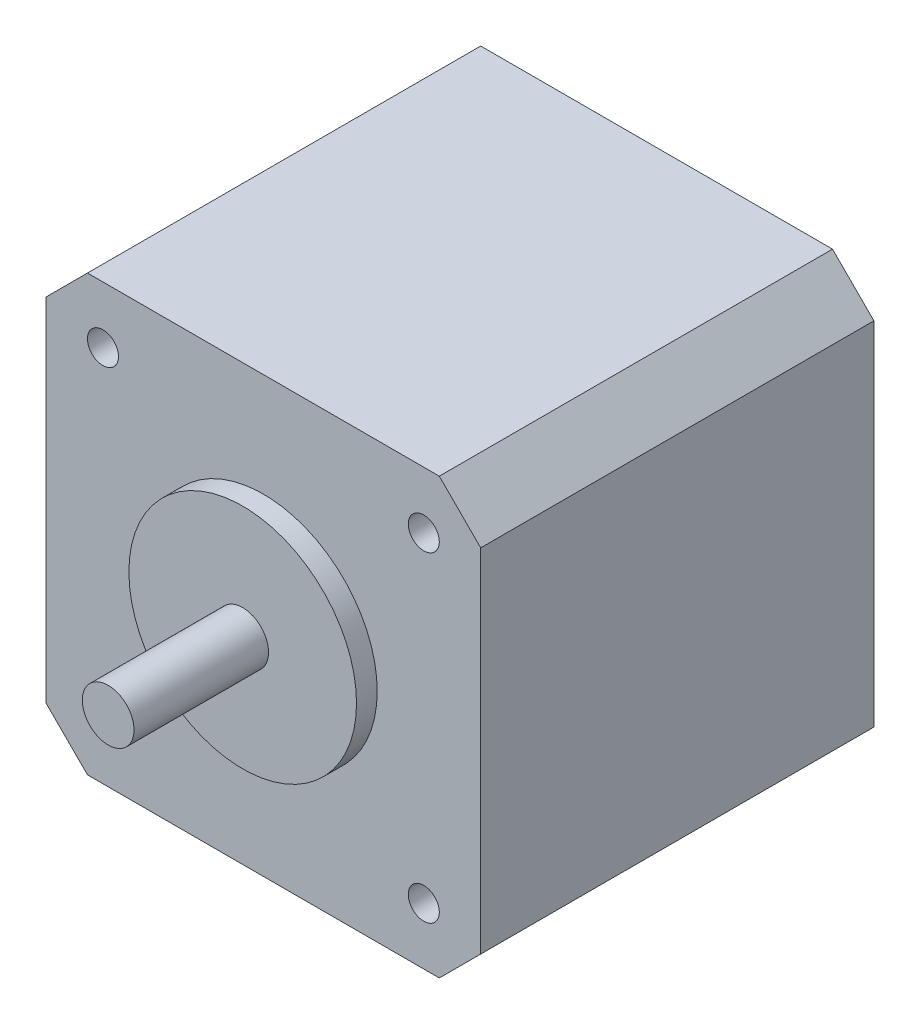
ISO-10303-21;
HEADER;
FILE_DESCRIPTION(('STEP AP214'),'2;1');
FILE_NAME('part.step','',(''),(''),'','','');
FILE_SCHEMA(('AUTOMOTIVE_DESIGN { 1 0 10303 214 1 1 1 1 }'));
ENDSEC;
DATA;
#1=APPLICATION_CONTEXT('core data for automotive mechanical design processes');
#2=APPLICATION_PROTOCOL_DEFINITION('international standard','automotive_design',2000,#1);
#3=PRODUCT_CONTEXT('',#1,'mechanical');
#4=PRODUCT('Part','Part','',(#3));
#5=PRODUCT_RELATED_PRODUCT_CATEGORY('part','',(#4));
#6=PRODUCT_DEFINITION_FORMATION('','',#4);
#7=PRODUCT_DEFINITION_CONTEXT('part definition',#1,'design');
#8=PRODUCT_DEFINITION('design','',#6,#7);
#9=PRODUCT_DEFINITION_SHAPE('','',#8);
#10=(LENGTH_UNIT() NAMED_UNIT(*) SI_UNIT(.MILLI.,.METRE.));
#11=(NAMED_UNIT(*) PLANE_ANGLE_UNIT() SI_UNIT($,.RADIAN.));
#12=(NAMED_UNIT(*) SI_UNIT($,.STERADIAN.) SOLID_ANGLE_UNIT());
#13=UNCERTAINTY_MEASURE_WITH_UNIT(LENGTH_MEASURE(1.E-05),#10,'distance_accuracy_value','');
#14=(GEOMETRIC_REPRESENTATION_CONTEXT(3) GLOBAL_UNCERTAINTY_ASSIGNED_CONTEXT((#13)) GLOBAL_UNIT_ASSIGNED_CONTEXT((#10,
#11,#12)) REPRESENTATION_CONTEXT('',''));
#15=CARTESIAN_POINT('',(0.,0.,0.));
#16=DIRECTION('',(0.,0.,1.));
#17=DIRECTION('',(1.,0.,0.));
#18=AXIS2_PLACEMENT_3D('',#15,#16,#17);
#19=CARTESIAN_POINT('',(-21.,-21.,38.));
#20=DIRECTION('',(0.,1.,0.));
#21=DIRECTION('',(0.,0.,1.));
#22=AXIS2_PLACEMENT_3D('',#19,#20,#21);
#23=PLANE('',#22);
#24=DIRECTION('',(1.,0.,0.));
#25=VECTOR('',#24,1.);
#26=CARTESIAN_POINT('',(-21.,-21.,38.));
#27=LINE('',#26,#25);
#28=CARTESIAN_POINT('',(-17.,-21.,38.));
#29=VERTEX_POINT('',#28);
#30=CARTESIAN_POINT('',(17.,-21.,38.));
#31=VERTEX_POINT('',#30);
#32=EDGE_CURVE('E195',#29,#31,#27,.T.);
#33=ORIENTED_EDGE('',*,*,#32,.F.);
#34=DIRECTION('',(0.,0.,-1.));
#35=VECTOR('',#34,1.);
#36=CARTESIAN_POINT('',(-17.,-21.,38.));
#37=LINE('',#36,#35);
#38=CARTESIAN_POINT('',(-17.,-21.,0.));
#39=VERTEX_POINT('',#38);
#40=EDGE_CURVE('E210',#29,#39,#37,.T.);
#41=ORIENTED_EDGE('',*,*,#40,.T.);
#42=DIRECTION('',(1.,0.,0.));
#43=VECTOR('',#42,1.);
#44=CARTESIAN_POINT('',(-21.,-21.,0.));
#45=LINE('',#44,#43);
#46=CARTESIAN_POINT('',(17.,-21.,0.));
#47=VERTEX_POINT('',#46);
#48=EDGE_CURVE('E189',#39,#47,#45,.T.);
#49=ORIENTED_EDGE('',*,*,#48,.T.);
#50=DIRECTION('',(0.,0.,1.));
#51=VECTOR('',#50,1.);
#52=CARTESIAN_POINT('',(17.,-21.,38.));
#53=LINE('',#52,#51);
#54=EDGE_CURVE('E198',#47,#31,#53,.T.);
#55=ORIENTED_EDGE('',*,*,#54,.T.);
#56=EDGE_LOOP('',(#33,#41,#49,#55));
#57=FACE_BOUND('',#56,.T.);
#58=CARTESIAN_POINT('',(1.35311646685743,-21.,3.77452291030522));
#59=DIRECTION('',(0.,-1.,0.));
#60=DIRECTION('',(0.,0.,-1.));
#61=AXIS2_PLACEMENT_3D('',#58,#59,#60);
#62=CIRCLE('',#61,0.660898569648793);
#63=CARTESIAN_POINT('',(1.35311646685743,-21.,3.11362434065643));
#64=VERTEX_POINT('',#63);
#65=CARTESIAN_POINT('',(1.35311646685743,-21.,4.43542147995402));
#66=VERTEX_POINT('',#65);
#67=EDGE_CURVE('E142',#64,#66,#62,.T.);
#68=ORIENTED_EDGE('',*,*,#67,.F.);
#69=DIRECTION('',(1.,0.,0.));
#70=VECTOR('',#69,1.);
#71=CARTESIAN_POINT('',(1.35311646685743,-21.,3.11362434065643));
#72=LINE('',#71,#70);
#73=CARTESIAN_POINT('',(-1.35311646685743,-21.,3.11362434065643));
#74=VERTEX_POINT('',#73);
#75=EDGE_CURVE('E139',#74,#64,#72,.T.);
#76=ORIENTED_EDGE('',*,*,#75,.F.);
#77=CARTESIAN_POINT('',(-1.35311646685743,-21.,3.77452291030522));
#78=DIRECTION('',(0.,-1.,0.));
#79=DIRECTION('',(0.,0.,-1.));
#80=AXIS2_PLACEMENT_3D('',#77,#78,#79);
#81=CIRCLE('',#80,0.660898569648793);
#82=CARTESIAN_POINT('',(-1.35311646685743,-21.,4.43542147995402));
#83=VERTEX_POINT('',#82);
#84=EDGE_CURVE('E53',#83,#74,#81,.T.);
#85=ORIENTED_EDGE('',*,*,#84,.F.);
#86=DIRECTION('',(-1.,0.,0.));
#87=VECTOR('',#86,1.);
#88=CARTESIAN_POINT('',(1.35311646685743,-21.,4.43542147995402));
#89=LINE('',#88,#87);
#90=EDGE_CURVE('E48',#66,#83,#89,.T.);
#91=ORIENTED_EDGE('',*,*,#90,.F.);
#92=EDGE_LOOP('',(#68,#76,#85,#91));
#93=FACE_BOUND('',#92,.T.);
#94=ADVANCED_FACE('F33',(#57,#93),#23,.F.);
#95=CARTESIAN_POINT('',(0.,0.,40.));
#96=DIRECTION('',(0.,0.,1.));
#97=DIRECTION('',(1.,0.,0.));
#98=AXIS2_PLACEMENT_3D('',#95,#96,#97);
#99=PLANE('',#98);
#100=CARTESIAN_POINT('',(0.,0.,40.));
#101=DIRECTION('',(0.,0.,1.));
#102=DIRECTION('',(1.,0.,0.));
#103=AXIS2_PLACEMENT_3D('',#100,#101,#102);
#104=CIRCLE('',#103,11.);
#105=CARTESIAN_POINT('',(11.,0.,40.));
#106=VERTEX_POINT('',#105);
#107=EDGE_CURVE('E179',#106,#106,#104,.T.);
#108=ORIENTED_EDGE('',*,*,#107,.T.);
#109=EDGE_LOOP('',(#108));
#110=FACE_BOUND('',#109,.T.);
#111=CARTESIAN_POINT('',(0.,0.,40.));
#112=DIRECTION('',(0.,0.,1.));
#113=DIRECTION('',(1.,0.,0.));
#114=AXIS2_PLACEMENT_3D('',#111,#112,#113);
#115=CIRCLE('',#114,2.5);
#116=CARTESIAN_POINT('',(-2.5,0.,40.));
#117=VERTEX_POINT('',#116);
#118=EDGE_CURVE('E170',#117,#117,#115,.T.);
#119=ORIENTED_EDGE('',*,*,#118,.F.);
#120=EDGE_LOOP('',(#119));
#121=FACE_BOUND('',#120,.T.);
#122=ADVANCED_FACE('F285',(#110,#121),#99,.T.);
#123=CARTESIAN_POINT('',(0.,0.,38.));
#124=DIRECTION('',(0.,0.,1.));
#125=DIRECTION('',(1.,0.,0.));
#126=AXIS2_PLACEMENT_3D('',#123,#124,#125);
#127=PLANE('',#126);
#128=CARTESIAN_POINT('',(15.5,-15.5,38.));
#129=DIRECTION('',(0.,0.,1.));
#130=DIRECTION('',(1.,0.,0.));
#131=AXIS2_PLACEMENT_3D('',#128,#129,#130);
#132=CIRCLE('',#131,1.5);
#133=CARTESIAN_POINT('',(17.,-15.5,38.));
#134=VERTEX_POINT('',#133);
#135=EDGE_CURVE('E143',#134,#134,#132,.T.);
#136=ORIENTED_EDGE('',*,*,#135,.F.);
#137=EDGE_LOOP('',(#136));
#138=FACE_BOUND('',#137,.T.);
#139=CARTESIAN_POINT('',(-15.5,-15.5,38.));
#140=DIRECTION('',(0.,0.,1.));
#141=DIRECTION('',(1.,0.,0.));
#142=AXIS2_PLACEMENT_3D('',#139,#140,#141);
#143=CIRCLE('',#142,1.5);
#144=CARTESIAN_POINT('',(-14.,-15.5,38.));
#145=VERTEX_POINT('',#144);
#146=EDGE_CURVE('E153',#145,#145,#143,.T.);
#147=ORIENTED_EDGE('',*,*,#146,.F.);
#148=EDGE_LOOP('',(#147));
#149=FACE_BOUND('',#148,.T.);
#150=CARTESIAN_POINT('',(-15.5,15.5,38.));
#151=DIRECTION('',(0.,0.,1.));
#152=DIRECTION('',(1.,0.,0.));
#153=AXIS2_PLACEMENT_3D('',#150,#151,#152);
#154=CIRCLE('',#153,1.5);
#155=CARTESIAN_POINT('',(-14.,15.5,38.));
#156=VERTEX_POINT('',#155);
#157=EDGE_CURVE('E158',#156,#156,#154,.T.);
#158=ORIENTED_EDGE('',*,*,#157,.F.);
#159=EDGE_LOOP('',(#158));
#160=FACE_BOUND('',#159,.T.);
#161=CARTESIAN_POINT('',(15.5,15.5,38.));
#162=DIRECTION('',(0.,0.,1.));
#163=DIRECTION('',(1.,0.,0.));
#164=AXIS2_PLACEMENT_3D('',#161,#162,#163);
#165=CIRCLE('',#164,1.5);
#166=CARTESIAN_POINT('',(17.,15.5,38.));
#167=VERTEX_POINT('',#166);
#168=EDGE_CURVE('E164',#167,#167,#165,.T.);
#169=ORIENTED_EDGE('',*,*,#168,.F.);
#170=EDGE_LOOP('',(#169));
#171=FACE_BOUND('',#170,.T.);
#172=DIRECTION('',(0.,-1.,0.));
#173=VECTOR('',#172,1.);
#174=CARTESIAN_POINT('',(-21.,21.,38.));
#175=LINE('',#174,#173);
#176=CARTESIAN_POINT('',(-21.,17.,38.));
#177=VERTEX_POINT('',#176);
#178=CARTESIAN_POINT('',(-21.,-17.,38.));
#179=VERTEX_POINT('',#178);
#180=EDGE_CURVE('E192',#177,#179,#175,.T.);
#181=ORIENTED_EDGE('',*,*,#180,.T.);
#182=DIRECTION('',(-0.707106781186546,0.707106781186549,0.));
#183=VECTOR('',#182,1.);
#184=CARTESIAN_POINT('',(-19.,-19.,38.));
#185=LINE('',#184,#183);
#186=EDGE_CURVE('E232',#179,#29,#185,.F.);
#187=ORIENTED_EDGE('',*,*,#186,.T.);
#188=ORIENTED_EDGE('',*,*,#32,.T.);
#189=DIRECTION('',(-0.707106781186549,-0.707106781186546,0.));
#190=VECTOR('',#189,1.);
#191=CARTESIAN_POINT('',(19.,-19.0000000000001,38.));
#192=LINE('',#191,#190);
#193=CARTESIAN_POINT('',(21.,-17.,38.));
#194=VERTEX_POINT('',#193);
#195=EDGE_CURVE('E228',#31,#194,#192,.F.);
#196=ORIENTED_EDGE('',*,*,#195,.T.);
#197=DIRECTION('',(0.,1.,0.));
#198=VECTOR('',#197,1.);
#199=CARTESIAN_POINT('',(21.,21.,38.));
#200=LINE('',#199,#198);
#201=CARTESIAN_POINT('',(21.,17.,38.));
#202=VERTEX_POINT('',#201);
#203=EDGE_CURVE('E185',#194,#202,#200,.T.);
#204=ORIENTED_EDGE('',*,*,#203,.T.);
#205=DIRECTION('',(0.707106781186546,-0.707106781186549,0.));
#206=VECTOR('',#205,1.);
#207=CARTESIAN_POINT('',(19.,19.,38.));
#208=LINE('',#207,#206);
#209=CARTESIAN_POINT('',(17.,21.,38.));
#210=VERTEX_POINT('',#209);
#211=EDGE_CURVE('E226',#202,#210,#208,.F.);
#212=ORIENTED_EDGE('',*,*,#211,.T.);
#213=DIRECTION('',(-1.,0.,0.));
#214=VECTOR('',#213,1.);
#215=CARTESIAN_POINT('',(-21.,21.,38.));
#216=LINE('',#215,#214);
#217=CARTESIAN_POINT('',(-17.,21.,38.));
#218=VERTEX_POINT('',#217);
#219=EDGE_CURVE('E188',#210,#218,#216,.T.);
#220=ORIENTED_EDGE('',*,*,#219,.T.);
#221=DIRECTION('',(0.707106781186549,0.707106781186546,0.));
#222=VECTOR('',#221,1.);
#223=CARTESIAN_POINT('',(-19.,19.,38.));
#224=LINE('',#223,#222);
#225=EDGE_CURVE('E230',#218,#177,#224,.F.);
#226=ORIENTED_EDGE('',*,*,#225,.T.);
#227=EDGE_LOOP('',(#181,#187,#188,#196,#204,#212,#220,#226));
#228=FACE_BOUND('',#227,.T.);
#229=CARTESIAN_POINT('',(0.,0.,38.));
#230=DIRECTION('',(0.,0.,1.));
#231=DIRECTION('',(1.,0.,0.));
#232=AXIS2_PLACEMENT_3D('',#229,#230,#231);
#233=CIRCLE('',#232,11.);
#234=CARTESIAN_POINT('',(11.,0.,38.));
#235=VERTEX_POINT('',#234);
#236=EDGE_CURVE('E176',#235,#235,#233,.T.);
#237=ORIENTED_EDGE('',*,*,#236,.F.);
#238=EDGE_LOOP('',(#237));
#239=FACE_BOUND('',#238,.T.);
#240=ADVANCED_FACE('F247',(#138,#149,#160,#171,#228,#239),#127,.T.);
#241=CARTESIAN_POINT('',(21.,21.,38.));
#242=DIRECTION('',(-1.,0.,0.));
#243=DIRECTION('',(0.,-1.,0.));
#244=AXIS2_PLACEMENT_3D('',#241,#242,#243);
#245=PLANE('',#244);
#246=ORIENTED_EDGE('',*,*,#203,.F.);
#247=DIRECTION('',(0.,0.,-1.));
#248=VECTOR('',#247,1.);
#249=CARTESIAN_POINT('',(21.,-17.,38.));
#250=LINE('',#249,#248);
#251=CARTESIAN_POINT('',(21.,-17.,0.));
#252=VERTEX_POINT('',#251);
#253=EDGE_CURVE('E11',#194,#252,#250,.T.);
#254=ORIENTED_EDGE('',*,*,#253,.T.);
#255=DIRECTION('',(0.,1.,0.));
#256=VECTOR('',#255,1.);
#257=CARTESIAN_POINT('',(21.,21.,0.));
#258=LINE('',#257,#256);
#259=CARTESIAN_POINT('',(21.,17.,0.));
#260=VERTEX_POINT('',#259);
#261=EDGE_CURVE('E182',#252,#260,#258,.T.);
#262=ORIENTED_EDGE('',*,*,#261,.T.);
#263=DIRECTION('',(0.,0.,1.));
#264=VECTOR('',#263,1.);
#265=CARTESIAN_POINT('',(21.,17.,38.));
#266=LINE('',#265,#264);
#267=EDGE_CURVE('E41',#260,#202,#266,.T.);
#268=ORIENTED_EDGE('',*,*,#267,.T.);
#269=EDGE_LOOP('',(#246,#254,#262,#268));
#270=FACE_BOUND('',#269,.T.);
#271=ADVANCED_FACE('F241',(#270),#245,.F.);
#272=CARTESIAN_POINT('',(-21.,21.,38.));
#273=DIRECTION('',(0.,-1.,0.));
#274=DIRECTION('',(0.,0.,-1.));
#275=AXIS2_PLACEMENT_3D('',#272,#273,#274);
#276=PLANE('',#275);
#277=DIRECTION('',(-1.,0.,0.));
#278=VECTOR('',#277,1.);
#279=CARTESIAN_POINT('',(-21.,21.,0.));
#280=LINE('',#279,#278);
#281=CARTESIAN_POINT('',(17.,21.,0.));
#282=VERTEX_POINT('',#281);
#283=CARTESIAN_POINT('',(-17.,21.,0.));
#284=VERTEX_POINT('',#283);
#285=EDGE_CURVE('E201',#282,#284,#280,.T.);
#286=ORIENTED_EDGE('',*,*,#285,.T.);
#287=DIRECTION('',(0.,0.,1.));
#288=VECTOR('',#287,1.);
#289=CARTESIAN_POINT('',(-17.,21.,38.));
#290=LINE('',#289,#288);
#291=EDGE_CURVE('E237',#284,#218,#290,.T.);
#292=ORIENTED_EDGE('',*,*,#291,.T.);
#293=ORIENTED_EDGE('',*,*,#219,.F.);
#294=DIRECTION('',(0.,0.,-1.));
#295=VECTOR('',#294,1.);
#296=CARTESIAN_POINT('',(17.,21.,38.));
#297=LINE('',#296,#295);
#298=EDGE_CURVE('E234',#210,#282,#297,.T.);
#299=ORIENTED_EDGE('',*,*,#298,.T.);
#300=EDGE_LOOP('',(#286,#292,#293,#299));
#301=FACE_BOUND('',#300,.T.);
#302=ADVANCED_FACE('F254',(#301),#276,.F.);
#303=CARTESIAN_POINT('',(-21.,21.,38.));
#304=DIRECTION('',(1.,0.,0.));
#305=DIRECTION('',(0.,1.,0.));
#306=AXIS2_PLACEMENT_3D('',#303,#304,#305);
#307=PLANE('',#306);
#308=DIRECTION('',(0.,-1.,0.));
#309=VECTOR('',#308,1.);
#310=CARTESIAN_POINT('',(-21.,21.,0.));
#311=LINE('',#310,#309);
#312=CARTESIAN_POINT('',(-21.,17.,0.));
#313=VERTEX_POINT('',#312);
#314=CARTESIAN_POINT('',(-21.,-17.,0.));
#315=VERTEX_POINT('',#314);
#316=EDGE_CURVE('E204',#313,#315,#311,.T.);
#317=ORIENTED_EDGE('',*,*,#316,.T.);
#318=DIRECTION('',(0.,0.,1.));
#319=VECTOR('',#318,1.);
#320=CARTESIAN_POINT('',(-21.,-17.,38.));
#321=LINE('',#320,#319);
#322=EDGE_CURVE('E224',#315,#179,#321,.T.);
#323=ORIENTED_EDGE('',*,*,#322,.T.);
#324=ORIENTED_EDGE('',*,*,#180,.F.);
#325=DIRECTION('',(0.,0.,-1.));
#326=VECTOR('',#325,1.);
#327=CARTESIAN_POINT('',(-21.,17.,38.));
#328=LINE('',#327,#326);
#329=EDGE_CURVE('E221',#177,#313,#328,.T.);
#330=ORIENTED_EDGE('',*,*,#329,.T.);
#331=EDGE_LOOP('',(#317,#323,#324,#330));
#332=FACE_BOUND('',#331,.T.);
#333=ADVANCED_FACE('F266',(#332),#307,.F.);
#334=CARTESIAN_POINT('',(0.,0.,0.));
#335=DIRECTION('',(0.,0.,1.));
#336=DIRECTION('',(1.,0.,0.));
#337=AXIS2_PLACEMENT_3D('',#334,#335,#336);
#338=PLANE('',#337);
#339=CARTESIAN_POINT('',(15.5,-15.5,0.));
#340=DIRECTION('',(0.,0.,1.));
#341=DIRECTION('',(1.,0.,0.));
#342=AXIS2_PLACEMENT_3D('',#339,#340,#341);
#343=CIRCLE('',#342,1.5);
#344=CARTESIAN_POINT('',(17.,-15.5,0.));
#345=VERTEX_POINT('',#344);
#346=EDGE_CURVE('E146',#345,#345,#343,.T.);
#347=ORIENTED_EDGE('',*,*,#346,.T.);
#348=EDGE_LOOP('',(#347));
#349=FACE_BOUND('',#348,.T.);
#350=CARTESIAN_POINT('',(-15.5,-15.5,0.));
#351=DIRECTION('',(0.,0.,1.));
#352=DIRECTION('',(1.,0.,0.));
#353=AXIS2_PLACEMENT_3D('',#350,#351,#352);
#354=CIRCLE('',#353,1.5);
#355=CARTESIAN_POINT('',(-14.,-15.5,0.));
#356=VERTEX_POINT('',#355);
#357=EDGE_CURVE('E155',#356,#356,#354,.T.);
#358=ORIENTED_EDGE('',*,*,#357,.T.);
#359=EDGE_LOOP('',(#358));
#360=FACE_BOUND('',#359,.T.);
#361=CARTESIAN_POINT('',(-15.5,15.5,0.));
#362=DIRECTION('',(0.,0.,1.));
#363=DIRECTION('',(1.,0.,0.));
#364=AXIS2_PLACEMENT_3D('',#361,#362,#363);
#365=CIRCLE('',#364,1.5);
#366=CARTESIAN_POINT('',(-14.,15.5,0.));
#367=VERTEX_POINT('',#366);
#368=EDGE_CURVE('E161',#367,#367,#365,.T.);
#369=ORIENTED_EDGE('',*,*,#368,.T.);
#370=EDGE_LOOP('',(#369));
#371=FACE_BOUND('',#370,.T.);
#372=CARTESIAN_POINT('',(15.5,15.5,0.));
#373=DIRECTION('',(0.,0.,1.));
#374=DIRECTION('',(1.,0.,0.));
#375=AXIS2_PLACEMENT_3D('',#372,#373,#374);
#376=CIRCLE('',#375,1.5);
#377=CARTESIAN_POINT('',(17.,15.5,0.));
#378=VERTEX_POINT('',#377);
#379=EDGE_CURVE('E167',#378,#378,#376,.T.);
#380=ORIENTED_EDGE('',*,*,#379,.T.);
#381=EDGE_LOOP('',(#380));
#382=FACE_BOUND('',#381,.T.);
#383=ORIENTED_EDGE('',*,*,#48,.F.);
#384=DIRECTION('',(0.707106781186546,-0.707106781186549,0.));
#385=VECTOR('',#384,1.);
#386=CARTESIAN_POINT('',(-17.,-21.,0.));
#387=LINE('',#386,#385);
#388=EDGE_CURVE('E219',#39,#315,#387,.F.);
#389=ORIENTED_EDGE('',*,*,#388,.T.);
#390=ORIENTED_EDGE('',*,*,#316,.F.);
#391=DIRECTION('',(-0.707106781186549,-0.707106781186546,0.));
#392=VECTOR('',#391,1.);
#393=CARTESIAN_POINT('',(-21.,17.,0.));
#394=LINE('',#393,#392);
#395=EDGE_CURVE('E217',#313,#284,#394,.F.);
#396=ORIENTED_EDGE('',*,*,#395,.T.);
#397=ORIENTED_EDGE('',*,*,#285,.F.);
#398=DIRECTION('',(-0.707106781186546,0.707106781186549,0.));
#399=VECTOR('',#398,1.);
#400=CARTESIAN_POINT('',(17.,21.,0.));
#401=LINE('',#400,#399);
#402=EDGE_CURVE('E213',#282,#260,#401,.F.);
#403=ORIENTED_EDGE('',*,*,#402,.T.);
#404=ORIENTED_EDGE('',*,*,#261,.F.);
#405=DIRECTION('',(0.707106781186549,0.707106781186546,0.));
#406=VECTOR('',#405,1.);
#407=CARTESIAN_POINT('',(21.,-17.,0.));
#408=LINE('',#407,#406);
#409=EDGE_CURVE('E215',#252,#47,#408,.F.);
#410=ORIENTED_EDGE('',*,*,#409,.T.);
#411=EDGE_LOOP('',(#383,#389,#390,#396,#397,#403,#404,#410));
#412=FACE_BOUND('',#411,.T.);
#413=ADVANCED_FACE('F258',(#349,#360,#371,#382,#412),#338,.F.);
#414=CARTESIAN_POINT('',(0.,0.,40.));
#415=DIRECTION('',(0.,0.,-1.));
#416=DIRECTION('',(-1.,0.,0.));
#417=AXIS2_PLACEMENT_3D('',#414,#415,#416);
#418=CYLINDRICAL_SURFACE('',#417,11.);
#419=ORIENTED_EDGE('',*,*,#107,.F.);
#420=EDGE_LOOP('',(#419));
#421=FACE_BOUND('',#420,.T.);
#422=ORIENTED_EDGE('',*,*,#236,.T.);
#423=EDGE_LOOP('',(#422));
#424=FACE_BOUND('',#423,.T.);
#425=ADVANCED_FACE('F314',(#421,#424),#418,.T.);
#426=CARTESIAN_POINT('',(0.,0.,53.));
#427=DIRECTION('',(0.,0.,-1.));
#428=DIRECTION('',(-1.,0.,0.));
#429=AXIS2_PLACEMENT_3D('',#426,#427,#428);
#430=CYLINDRICAL_SURFACE('',#429,2.5);
#431=CARTESIAN_POINT('',(0.,0.,53.));
#432=DIRECTION('',(0.,0.,1.));
#433=DIRECTION('',(1.,0.,0.));
#434=AXIS2_PLACEMENT_3D('',#431,#432,#433);
#435=CIRCLE('',#434,2.5);
#436=CARTESIAN_POINT('',(-2.5,0.,53.));
#437=VERTEX_POINT('',#436);
#438=EDGE_CURVE('E173',#437,#437,#435,.T.);
#439=CARTESIAN_POINT('',(-2.5,0.,53.));
#440=CARTESIAN_POINT('',(-2.5,0.,52.8645833333333));
#441=CARTESIAN_POINT('',(-2.5,0.,52.7291666666667));
#442=CARTESIAN_POINT('',(-2.5,0.,52.4583333333333));
#443=CARTESIAN_POINT('',(-2.5,0.,52.3229166666667));
#444=CARTESIAN_POINT('',(-2.5,0.,52.0520833333333));
#445=CARTESIAN_POINT('',(-2.5,0.,51.9166666666667));
#446=CARTESIAN_POINT('',(-2.5,0.,51.6458333333333));
#447=CARTESIAN_POINT('',(-2.5,0.,51.5104166666667));
#448=CARTESIAN_POINT('',(-2.5,0.,51.2395833333333));
#449=CARTESIAN_POINT('',(-2.5,0.,51.1041666666667));
#450=CARTESIAN_POINT('',(-2.5,0.,50.8333333333333));
#451=CARTESIAN_POINT('',(-2.5,0.,50.6979166666667));
#452=CARTESIAN_POINT('',(-2.5,0.,50.4270833333333));
#453=CARTESIAN_POINT('',(-2.5,0.,50.2916666666667));
#454=CARTESIAN_POINT('',(-2.5,0.,50.0208333333333));
#455=CARTESIAN_POINT('',(-2.5,0.,49.8854166666667));
#456=CARTESIAN_POINT('',(-2.5,0.,49.6145833333333));
#457=CARTESIAN_POINT('',(-2.5,0.,49.4791666666667));
#458=CARTESIAN_POINT('',(-2.5,0.,49.2083333333333));
#459=CARTESIAN_POINT('',(-2.5,0.,49.0729166666667));
#460=CARTESIAN_POINT('',(-2.5,0.,48.8020833333333));
#461=CARTESIAN_POINT('',(-2.5,0.,48.6666666666667));
#462=CARTESIAN_POINT('',(-2.5,0.,48.3958333333333));
#463=CARTESIAN_POINT('',(-2.5,0.,48.2604166666667));
#464=CARTESIAN_POINT('',(-2.5,0.,47.9895833333333));
#465=CARTESIAN_POINT('',(-2.5,0.,47.8541666666667));
#466=CARTESIAN_POINT('',(-2.5,0.,47.5833333333333));
#467=CARTESIAN_POINT('',(-2.5,0.,47.4479166666667));
#468=CARTESIAN_POINT('',(-2.5,0.,47.1770833333333));
#469=CARTESIAN_POINT('',(-2.5,0.,47.0416666666667));
#470=CARTESIAN_POINT('',(-2.5,0.,46.7708333333333));
#471=CARTESIAN_POINT('',(-2.5,0.,46.6354166666667));
#472=CARTESIAN_POINT('',(-2.5,0.,46.3645833333333));
#473=CARTESIAN_POINT('',(-2.5,0.,46.2291666666667));
#474=CARTESIAN_POINT('',(-2.5,0.,45.9583333333333));
#475=CARTESIAN_POINT('',(-2.5,0.,45.8229166666667));
#476=CARTESIAN_POINT('',(-2.5,0.,45.5520833333333));
#477=CARTESIAN_POINT('',(-2.5,0.,45.4166666666667));
#478=CARTESIAN_POINT('',(-2.5,0.,45.1458333333333));
#479=CARTESIAN_POINT('',(-2.5,0.,45.0104166666667));
#480=CARTESIAN_POINT('',(-2.5,0.,44.7395833333333));
#481=CARTESIAN_POINT('',(-2.5,0.,44.6041666666667));
#482=CARTESIAN_POINT('',(-2.5,0.,44.3333333333333));
#483=CARTESIAN_POINT('',(-2.5,0.,44.1979166666667));
#484=CARTESIAN_POINT('',(-2.5,0.,43.9270833333333));
#485=CARTESIAN_POINT('',(-2.5,0.,43.7916666666667));
#486=CARTESIAN_POINT('',(-2.5,0.,43.5208333333333));
#487=CARTESIAN_POINT('',(-2.5,0.,43.3854166666667));
#488=CARTESIAN_POINT('',(-2.5,0.,43.1145833333333));
#489=CARTESIAN_POINT('',(-2.5,0.,42.9791666666667));
#490=CARTESIAN_POINT('',(-2.5,0.,42.7083333333333));
#491=CARTESIAN_POINT('',(-2.5,0.,42.5729166666667));
#492=CARTESIAN_POINT('',(-2.5,0.,42.3020833333333));
#493=CARTESIAN_POINT('',(-2.5,0.,42.1666666666667));
#494=CARTESIAN_POINT('',(-2.5,0.,41.8958333333333));
#495=CARTESIAN_POINT('',(-2.5,0.,41.7604166666667));
#496=CARTESIAN_POINT('',(-2.5,0.,41.4895833333333));
#497=CARTESIAN_POINT('',(-2.5,0.,41.3541666666667));
#498=CARTESIAN_POINT('',(-2.5,0.,41.0833333333333));
#499=CARTESIAN_POINT('',(-2.5,0.,40.9479166666667));
#500=CARTESIAN_POINT('',(-2.5,0.,40.6770833333333));
#501=CARTESIAN_POINT('',(-2.5,0.,40.5416666666667));
#502=CARTESIAN_POINT('',(-2.5,0.,40.2708333333333));
#503=CARTESIAN_POINT('',(-2.5,0.,40.1354166666667));
#504=CARTESIAN_POINT('',(-2.5,0.,40.));
#505=B_SPLINE_CURVE_WITH_KNOTS('',3,(#439,#440,#441,#442,#443,#444,#445,#446,#447,#448,#449,
#450,#451,#452,#453,#454,#455,#456,#457,#458,#459,#460,#461,#462,#463,#464,#465,#466,#467,#468,
#469,#470,#471,#472,#473,#474,#475,#476,#477,#478,#479,#480,#481,#482,#483,#484,#485,#486,#487,
#488,#489,#490,#491,#492,#493,#494,#495,#496,#497,#498,#499,#500,#501,#502,#503,#504),
.UNSPECIFIED.,.F.,.F.,(4,2,2,2,2,2,2,2,2,2,2,2,2,2,2,2,2,2,2,2,2,2,2,2,2,2,2,2,2,2,2,2,4),(0.,
0.406249999999997,0.812499999999994,1.21875,1.62499999999999,2.03125,2.4375,2.84374999999999,
3.25,3.65624999999999,4.0625,4.46874999999999,4.875,5.28124999999999,5.6875,6.09374999999999,
6.49999999999999,6.90625,7.31249999999999,7.71875,8.12499999999999,8.53124999999999,
8.93749999999999,9.34374999999999,9.74999999999999,10.15625,10.5625,10.96875,11.375,11.78125,
12.1875,12.59375,13.),.UNSPECIFIED.);
#506=EDGE_CURVE('BSEAM308',#437,#117,#505,.T.);
#507=ORIENTED_EDGE('',*,*,#438,.F.);
#508=ORIENTED_EDGE('',*,*,#118,.T.);
#509=ORIENTED_EDGE('',*,*,#506,.T.);
#510=ORIENTED_EDGE('',*,*,#506,.F.);
#511=EDGE_LOOP('',(#507,#509,#508,#510));
#512=FACE_BOUND('',#511,.T.);
#513=ADVANCED_FACE('F308',(#512),#430,.T.);
#514=CARTESIAN_POINT('',(0.,0.,53.));
#515=DIRECTION('',(0.,0.,1.));
#516=DIRECTION('',(1.,0.,0.));
#517=AXIS2_PLACEMENT_3D('',#514,#515,#516);
#518=PLANE('',#517);
#519=ORIENTED_EDGE('',*,*,#438,.T.);
#520=EDGE_LOOP('',(#519));
#521=FACE_BOUND('',#520,.T.);
#522=ADVANCED_FACE('F304',(#521),#518,.T.);
#523=CARTESIAN_POINT('',(-17.,-21.,38.));
#524=DIRECTION('',(0.707106781186549,0.707106781186546,0.));
#525=DIRECTION('',(0.,0.,-1.));
#526=AXIS2_PLACEMENT_3D('',#523,#524,#525);
#527=PLANE('',#526);
#528=ORIENTED_EDGE('',*,*,#186,.F.);
#529=ORIENTED_EDGE('',*,*,#322,.F.);
#530=ORIENTED_EDGE('',*,*,#388,.F.);
#531=ORIENTED_EDGE('',*,*,#40,.F.);
#532=EDGE_LOOP('',(#528,#529,#530,#531));
#533=FACE_BOUND('',#532,.T.);
#534=ADVANCED_FACE('F272',(#533),#527,.F.);
#535=CARTESIAN_POINT('',(-21.,17.,38.));
#536=DIRECTION('',(0.707106781186546,-0.707106781186549,0.));
#537=DIRECTION('',(0.,0.,-1.));
#538=AXIS2_PLACEMENT_3D('',#535,#536,#537);
#539=PLANE('',#538);
#540=ORIENTED_EDGE('',*,*,#225,.F.);
#541=ORIENTED_EDGE('',*,*,#291,.F.);
#542=ORIENTED_EDGE('',*,*,#395,.F.);
#543=ORIENTED_EDGE('',*,*,#329,.F.);
#544=EDGE_LOOP('',(#540,#541,#542,#543));
#545=FACE_BOUND('',#544,.T.);
#546=ADVANCED_FACE('F263',(#545),#539,.F.);
#547=CARTESIAN_POINT('',(21.,-17.,38.));
#548=DIRECTION('',(-0.707106781186546,0.707106781186549,0.));
#549=DIRECTION('',(0.,0.,-1.));
#550=AXIS2_PLACEMENT_3D('',#547,#548,#549);
#551=PLANE('',#550);
#552=ORIENTED_EDGE('',*,*,#195,.F.);
#553=ORIENTED_EDGE('',*,*,#54,.F.);
#554=ORIENTED_EDGE('',*,*,#409,.F.);
#555=ORIENTED_EDGE('',*,*,#253,.F.);
#556=EDGE_LOOP('',(#552,#553,#554,#555));
#557=FACE_BOUND('',#556,.T.);
#558=ADVANCED_FACE('F276',(#557),#551,.F.);
#559=CARTESIAN_POINT('',(17.,21.,38.));
#560=DIRECTION('',(-0.707106781186549,-0.707106781186546,0.));
#561=DIRECTION('',(0.,0.,-1.));
#562=AXIS2_PLACEMENT_3D('',#559,#560,#561);
#563=PLANE('',#562);
#564=ORIENTED_EDGE('',*,*,#211,.F.);
#565=ORIENTED_EDGE('',*,*,#267,.F.);
#566=ORIENTED_EDGE('',*,*,#402,.F.);
#567=ORIENTED_EDGE('',*,*,#298,.F.);
#568=EDGE_LOOP('',(#564,#565,#566,#567));
#569=FACE_BOUND('',#568,.T.);
#570=ADVANCED_FACE('F35',(#569),#563,.F.);
#571=CARTESIAN_POINT('',(15.5,15.5,0.));
#572=DIRECTION('',(0.,0.,1.));
#573=DIRECTION('',(1.,0.,0.));
#574=AXIS2_PLACEMENT_3D('',#571,#572,#573);
#575=CYLINDRICAL_SURFACE('',#574,1.5);
#576=ORIENTED_EDGE('',*,*,#379,.F.);
#577=EDGE_LOOP('',(#576));
#578=FACE_BOUND('',#577,.T.);
#579=ORIENTED_EDGE('',*,*,#168,.T.);
#580=EDGE_LOOP('',(#579));
#581=FACE_BOUND('',#580,.T.);
#582=ADVANCED_FACE('F282',(#578,#581),#575,.F.);
#583=CARTESIAN_POINT('',(-15.5,15.5,0.));
#584=DIRECTION('',(0.,0.,1.));
#585=DIRECTION('',(1.,0.,0.));
#586=AXIS2_PLACEMENT_3D('',#583,#584,#585);
#587=CYLINDRICAL_SURFACE('',#586,1.5);
#588=ORIENTED_EDGE('',*,*,#368,.F.);
#589=EDGE_LOOP('',(#588));
#590=FACE_BOUND('',#589,.T.);
#591=ORIENTED_EDGE('',*,*,#157,.T.);
#592=EDGE_LOOP('',(#591));
#593=FACE_BOUND('',#592,.T.);
#594=ADVANCED_FACE('F335',(#590,#593),#587,.F.);
#595=CARTESIAN_POINT('',(-15.5,-15.5,0.));
#596=DIRECTION('',(0.,0.,1.));
#597=DIRECTION('',(1.,0.,0.));
#598=AXIS2_PLACEMENT_3D('',#595,#596,#597);
#599=CYLINDRICAL_SURFACE('',#598,1.5);
#600=ORIENTED_EDGE('',*,*,#357,.F.);
#601=EDGE_LOOP('',(#600));
#602=FACE_BOUND('',#601,.T.);
#603=ORIENTED_EDGE('',*,*,#146,.T.);
#604=EDGE_LOOP('',(#603));
#605=FACE_BOUND('',#604,.T.);
#606=ADVANCED_FACE('F340',(#602,#605),#599,.F.);
#607=CARTESIAN_POINT('',(15.5,-15.5,0.));
#608=DIRECTION('',(0.,0.,1.));
#609=DIRECTION('',(1.,0.,0.));
#610=AXIS2_PLACEMENT_3D('',#607,#608,#609);
#611=CYLINDRICAL_SURFACE('',#610,1.5);
#612=ORIENTED_EDGE('',*,*,#346,.F.);
#613=EDGE_LOOP('',(#612));
#614=FACE_BOUND('',#613,.T.);
#615=ORIENTED_EDGE('',*,*,#135,.T.);
#616=EDGE_LOOP('',(#615));
#617=FACE_BOUND('',#616,.T.);
#618=ADVANCED_FACE('F357',(#614,#617),#611,.F.);
#619=CARTESIAN_POINT('',(1.35311646685743,-24.,3.77452291030522));
#620=DIRECTION('',(0.,1.,0.));
#621=DIRECTION('',(0.,0.,1.));
#622=AXIS2_PLACEMENT_3D('',#619,#620,#621);
#623=CYLINDRICAL_SURFACE('',#622,0.660898569648793);
#624=ORIENTED_EDGE('',*,*,#67,.T.);
#625=DIRECTION('',(0.,1.,0.));
#626=VECTOR('',#625,1.);
#627=CARTESIAN_POINT('',(1.35311646685743,-24.,4.43542147995402));
#628=LINE('',#627,#626);
#629=CARTESIAN_POINT('',(1.35311646685743,-24.,4.43542147995402));
#630=VERTEX_POINT('',#629);
#631=EDGE_CURVE('E123',#630,#66,#628,.T.);
#632=ORIENTED_EDGE('',*,*,#631,.F.);
#633=CARTESIAN_POINT('',(1.35311646685743,-24.,3.77452291030522));
#634=DIRECTION('',(0.,-1.,0.));
#635=DIRECTION('',(0.,0.,-1.));
#636=AXIS2_PLACEMENT_3D('',#633,#634,#635);
#637=CIRCLE('',#636,0.660898569648793);
#638=CARTESIAN_POINT('',(1.35311646685743,-24.,3.11362434065643));
#639=VERTEX_POINT('',#638);
#640=EDGE_CURVE('E130',#639,#630,#637,.T.);
#641=ORIENTED_EDGE('',*,*,#640,.F.);
#642=DIRECTION('',(0.,1.,0.));
#643=VECTOR('',#642,1.);
#644=CARTESIAN_POINT('',(1.35311646685743,-24.,3.11362434065643));
#645=LINE('',#644,#643);
#646=EDGE_CURVE('E500',#639,#64,#645,.T.);
#647=ORIENTED_EDGE('',*,*,#646,.T.);
#648=EDGE_LOOP('',(#624,#632,#641,#647));
#649=FACE_BOUND('',#648,.T.);
#650=ADVANCED_FACE('F141',(#649),#623,.T.);
#651=CARTESIAN_POINT('',(1.35311646685743,-24.,4.43542147995402));
#652=DIRECTION('',(0.,0.,-1.));
#653=DIRECTION('',(-1.,0.,0.));
#654=AXIS2_PLACEMENT_3D('',#651,#652,#653);
#655=PLANE('',#654);
#656=ORIENTED_EDGE('',*,*,#90,.T.);
#657=DIRECTION('',(0.,1.,0.));
#658=VECTOR('',#657,1.);
#659=CARTESIAN_POINT('',(-1.35311646685743,-24.,4.43542147995402));
#660=LINE('',#659,#658);
#661=CARTESIAN_POINT('',(-1.35311646685743,-24.,4.43542147995402));
#662=VERTEX_POINT('',#661);
#663=EDGE_CURVE('E126',#662,#83,#660,.T.);
#664=ORIENTED_EDGE('',*,*,#663,.F.);
#665=DIRECTION('',(-1.,0.,0.));
#666=VECTOR('',#665,1.);
#667=CARTESIAN_POINT('',(1.35311646685743,-24.,4.43542147995402));
#668=LINE('',#667,#666);
#669=EDGE_CURVE('E119',#630,#662,#668,.T.);
#670=ORIENTED_EDGE('',*,*,#669,.F.);
#671=ORIENTED_EDGE('',*,*,#631,.T.);
#672=EDGE_LOOP('',(#656,#664,#670,#671));
#673=FACE_BOUND('',#672,.T.);
#674=ADVANCED_FACE('F121',(#673),#655,.F.);
#675=CARTESIAN_POINT('',(-1.35311646685743,-24.,3.77452291030522));
#676=DIRECTION('',(0.,1.,0.));
#677=DIRECTION('',(0.,0.,1.));
#678=AXIS2_PLACEMENT_3D('',#675,#676,#677);
#679=CYLINDRICAL_SURFACE('',#678,0.660898569648793);
#680=ORIENTED_EDGE('',*,*,#84,.T.);
#681=DIRECTION('',(0.,1.,0.));
#682=VECTOR('',#681,1.);
#683=CARTESIAN_POINT('',(-1.35311646685743,-24.,3.11362434065643));
#684=LINE('',#683,#682);
#685=CARTESIAN_POINT('',(-1.35311646685743,-24.,3.11362434065643));
#686=VERTEX_POINT('',#685);
#687=EDGE_CURVE('E148',#686,#74,#684,.T.);
#688=ORIENTED_EDGE('',*,*,#687,.F.);
#689=CARTESIAN_POINT('',(-1.35311646685743,-24.,3.77452291030522));
#690=DIRECTION('',(0.,-1.,0.));
#691=DIRECTION('',(0.,0.,-1.));
#692=AXIS2_PLACEMENT_3D('',#689,#690,#691);
#693=CIRCLE('',#692,0.660898569648793);
#694=EDGE_CURVE('E129',#662,#686,#693,.T.);
#695=ORIENTED_EDGE('',*,*,#694,.F.);
#696=ORIENTED_EDGE('',*,*,#663,.T.);
#697=EDGE_LOOP('',(#680,#688,#695,#696));
#698=FACE_BOUND('',#697,.T.);
#699=ADVANCED_FACE('F369',(#698),#679,.T.);
#700=CARTESIAN_POINT('',(1.35311646685743,-24.,3.11362434065643));
#701=DIRECTION('',(0.,0.,1.));
#702=DIRECTION('',(1.,0.,0.));
#703=AXIS2_PLACEMENT_3D('',#700,#701,#702);
#704=PLANE('',#703);
#705=ORIENTED_EDGE('',*,*,#75,.T.);
#706=ORIENTED_EDGE('',*,*,#646,.F.);
#707=DIRECTION('',(1.,0.,0.));
#708=VECTOR('',#707,1.);
#709=CARTESIAN_POINT('',(1.35311646685743,-24.,3.11362434065643));
#710=LINE('',#709,#708);
#711=EDGE_CURVE('E135',#686,#639,#710,.T.);
#712=ORIENTED_EDGE('',*,*,#711,.F.);
#713=ORIENTED_EDGE('',*,*,#687,.T.);
#714=EDGE_LOOP('',(#705,#706,#712,#713));
#715=FACE_BOUND('',#714,.T.);
#716=ADVANCED_FACE('F372',(#715),#704,.F.);
#717=CARTESIAN_POINT('',(1.35311646685743,-24.,3.77452291030522));
#718=DIRECTION('',(0.,-1.,0.));
#719=DIRECTION('',(0.,0.,-1.));
#720=AXIS2_PLACEMENT_3D('',#717,#718,#719);
#721=PLANE('',#720);
#722=ORIENTED_EDGE('',*,*,#640,.T.);
#723=ORIENTED_EDGE('',*,*,#669,.T.);
#724=ORIENTED_EDGE('',*,*,#694,.T.);
#725=ORIENTED_EDGE('',*,*,#711,.T.);
#726=EDGE_LOOP('',(#722,#723,#724,#725));
#727=FACE_BOUND('',#726,.T.);
#728=ADVANCED_FACE('F133',(#727),#721,.T.);
#729=CLOSED_SHELL('',(#94,#122,#240,#271,#302,#333,#413,#425,#513,#522,#534,#546,#558,#570,#582,
#594,#606,#618,#650,#674,#699,#716,#728));
#730=MANIFOLD_SOLID_BREP('B2',#729);
#731=ADVANCED_BREP_SHAPE_REPRESENTATION('',(#18,#730),#14);
#732=SHAPE_DEFINITION_REPRESENTATION(#9,#731);
ENDSEC;
END-ISO-10303-21;
